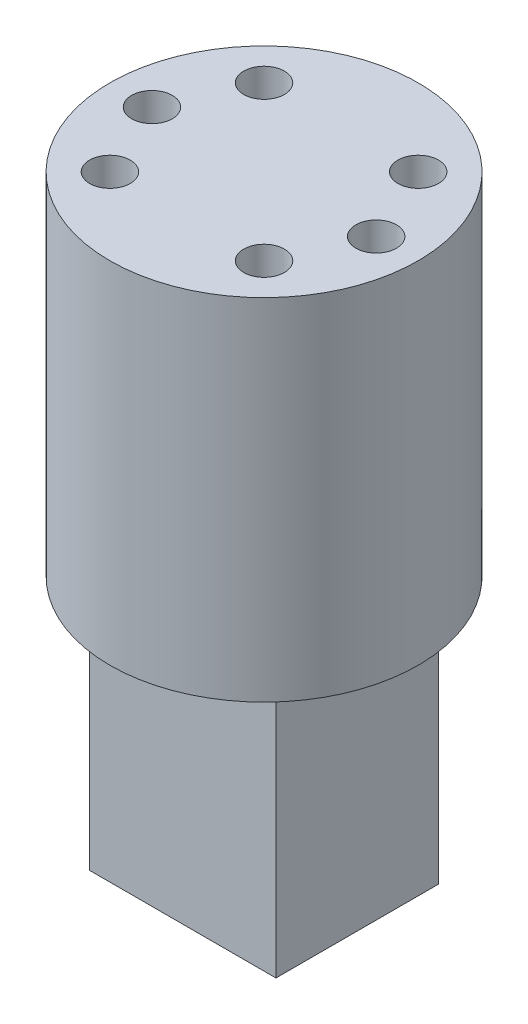
ISO-10303-21;
HEADER;
FILE_DESCRIPTION(('STEP AP214'),'2;1');
FILE_NAME('part.step','',(''),(''),'','','');
FILE_SCHEMA(('AUTOMOTIVE_DESIGN { 1 0 10303 214 1 1 1 1 }'));
ENDSEC;
DATA;
#1=APPLICATION_CONTEXT('core data for automotive mechanical design processes');
#2=APPLICATION_PROTOCOL_DEFINITION('international standard','automotive_design',2000,#1);
#3=PRODUCT_CONTEXT('',#1,'mechanical');
#4=PRODUCT('Part','Part','',(#3));
#5=PRODUCT_RELATED_PRODUCT_CATEGORY('part','',(#4));
#6=PRODUCT_DEFINITION_FORMATION('','',#4);
#7=PRODUCT_DEFINITION_CONTEXT('part definition',#1,'design');
#8=PRODUCT_DEFINITION('design','',#6,#7);
#9=PRODUCT_DEFINITION_SHAPE('','',#8);
#10=(LENGTH_UNIT() NAMED_UNIT(*) SI_UNIT(.MILLI.,.METRE.));
#11=(NAMED_UNIT(*) PLANE_ANGLE_UNIT() SI_UNIT($,.RADIAN.));
#12=(NAMED_UNIT(*) SI_UNIT($,.STERADIAN.) SOLID_ANGLE_UNIT());
#13=UNCERTAINTY_MEASURE_WITH_UNIT(LENGTH_MEASURE(1.E-05),#10,'distance_accuracy_value','');
#14=(GEOMETRIC_REPRESENTATION_CONTEXT(3) GLOBAL_UNCERTAINTY_ASSIGNED_CONTEXT((#13)) GLOBAL_UNIT_ASSIGNED_CONTEXT((#10,
#11,#12)) REPRESENTATION_CONTEXT('',''));
#15=CARTESIAN_POINT('',(0.,0.,0.));
#16=DIRECTION('',(0.,0.,1.));
#17=DIRECTION('',(1.,0.,0.));
#18=AXIS2_PLACEMENT_3D('',#15,#16,#17);
#19=CARTESIAN_POINT('',(0.,-25.,0.));
#20=DIRECTION('',(0.,1.,0.));
#21=DIRECTION('',(0.,0.,1.));
#22=AXIS2_PLACEMENT_3D('',#19,#20,#21);
#23=PLANE('',#22);
#24=CARTESIAN_POINT('',(0.,-25.,0.));
#25=DIRECTION('',(0.,1.,0.));
#26=DIRECTION('',(0.,0.,1.));
#27=AXIS2_PLACEMENT_3D('',#24,#25,#26);
#28=CIRCLE('',#27,11.);
#29=CARTESIAN_POINT('',(0.,-25.,11.));
#30=VERTEX_POINT('',#29);
#31=EDGE_CURVE('E48',#30,#30,#28,.T.);
#32=ORIENTED_EDGE('',*,*,#31,.F.);
#33=EDGE_LOOP('',(#32));
#34=FACE_BOUND('',#33,.T.);
#35=DIRECTION('',(0.,0.,1.));
#36=VECTOR('',#35,1.);
#37=CARTESIAN_POINT('',(6.65,-25.,5.8));
#38=LINE('',#37,#36);
#39=CARTESIAN_POINT('',(6.65,-25.,-5.8));
#40=VERTEX_POINT('',#39);
#41=CARTESIAN_POINT('',(6.65,-25.,5.8));
#42=VERTEX_POINT('',#41);
#43=EDGE_CURVE('E54',#40,#42,#38,.T.);
#44=ORIENTED_EDGE('',*,*,#43,.F.);
#45=DIRECTION('',(1.,0.,0.));
#46=VECTOR('',#45,1.);
#47=CARTESIAN_POINT('',(-6.65,-25.,-5.8));
#48=LINE('',#47,#46);
#49=CARTESIAN_POINT('',(-6.65,-25.,-5.8));
#50=VERTEX_POINT('',#49);
#51=EDGE_CURVE('E58',#50,#40,#48,.T.);
#52=ORIENTED_EDGE('',*,*,#51,.F.);
#53=DIRECTION('',(0.,0.,-1.));
#54=VECTOR('',#53,1.);
#55=CARTESIAN_POINT('',(-6.65,-25.,5.8));
#56=LINE('',#55,#54);
#57=CARTESIAN_POINT('',(-6.65,-25.,5.8));
#58=VERTEX_POINT('',#57);
#59=EDGE_CURVE('E157',#58,#50,#56,.T.);
#60=ORIENTED_EDGE('',*,*,#59,.F.);
#61=DIRECTION('',(-1.,0.,0.));
#62=VECTOR('',#61,1.);
#63=CARTESIAN_POINT('',(-6.65,-25.,5.8));
#64=LINE('',#63,#62);
#65=EDGE_CURVE('E156',#42,#58,#64,.T.);
#66=ORIENTED_EDGE('',*,*,#65,.F.);
#67=EDGE_LOOP('',(#44,#52,#60,#66));
#68=FACE_BOUND('',#67,.T.);
#69=ADVANCED_FACE('F37',(#34,#68),#23,.F.);
#70=CARTESIAN_POINT('',(0.,-25.,0.));
#71=DIRECTION('',(0.,1.,0.));
#72=DIRECTION('',(0.,0.,1.));
#73=AXIS2_PLACEMENT_3D('',#70,#71,#72);
#74=CYLINDRICAL_SURFACE('',#73,11.);
#75=ORIENTED_EDGE('',*,*,#31,.T.);
#76=EDGE_LOOP('',(#75));
#77=FACE_BOUND('',#76,.T.);
#78=CARTESIAN_POINT('',(0.,0.,0.));
#79=DIRECTION('',(0.,1.,0.));
#80=DIRECTION('',(0.,0.,1.));
#81=AXIS2_PLACEMENT_3D('',#78,#79,#80);
#82=CIRCLE('',#81,11.);
#83=CARTESIAN_POINT('',(0.,0.,11.));
#84=VERTEX_POINT('',#83);
#85=EDGE_CURVE('E152',#84,#84,#82,.T.);
#86=ORIENTED_EDGE('',*,*,#85,.F.);
#87=EDGE_LOOP('',(#86));
#88=FACE_BOUND('',#87,.T.);
#89=ADVANCED_FACE('F45',(#77,#88),#74,.T.);
#90=CARTESIAN_POINT('',(0.,0.,0.));
#91=DIRECTION('',(0.,1.,0.));
#92=DIRECTION('',(0.,0.,1.));
#93=AXIS2_PLACEMENT_3D('',#90,#91,#92);
#94=PLANE('',#93);
#95=CARTESIAN_POINT('',(-5.5,0.,-5.5));
#96=DIRECTION('',(0.,1.,0.));
#97=DIRECTION('',(0.,0.,1.));
#98=AXIS2_PLACEMENT_3D('',#95,#96,#97);
#99=CIRCLE('',#98,1.44999999999999);
#100=CARTESIAN_POINT('',(-5.5,0.,-4.05000000000001));
#101=VERTEX_POINT('',#100);
#102=EDGE_CURVE('E109',#101,#101,#99,.T.);
#103=ORIENTED_EDGE('',*,*,#102,.F.);
#104=EDGE_LOOP('',(#103));
#105=FACE_BOUND('',#104,.T.);
#106=CARTESIAN_POINT('',(5.5,0.,5.5));
#107=DIRECTION('',(0.,1.,0.));
#108=DIRECTION('',(0.,0.,1.));
#109=AXIS2_PLACEMENT_3D('',#106,#107,#108);
#110=CIRCLE('',#109,1.44999999999999);
#111=CARTESIAN_POINT('',(5.5,0.,6.94999999999999));
#112=VERTEX_POINT('',#111);
#113=EDGE_CURVE('E108',#112,#112,#110,.T.);
#114=ORIENTED_EDGE('',*,*,#113,.F.);
#115=EDGE_LOOP('',(#114));
#116=FACE_BOUND('',#115,.T.);
#117=CARTESIAN_POINT('',(-5.5,0.,5.5));
#118=DIRECTION('',(0.,1.,0.));
#119=DIRECTION('',(0.,0.,1.));
#120=AXIS2_PLACEMENT_3D('',#117,#118,#119);
#121=CIRCLE('',#120,1.44999999999999);
#122=CARTESIAN_POINT('',(-5.5,0.,6.94999999999999));
#123=VERTEX_POINT('',#122);
#124=EDGE_CURVE('E117',#123,#123,#121,.T.);
#125=ORIENTED_EDGE('',*,*,#124,.F.);
#126=EDGE_LOOP('',(#125));
#127=FACE_BOUND('',#126,.T.);
#128=CARTESIAN_POINT('',(5.5,0.,-5.5));
#129=DIRECTION('',(0.,1.,0.));
#130=DIRECTION('',(0.,0.,1.));
#131=AXIS2_PLACEMENT_3D('',#128,#129,#130);
#132=CIRCLE('',#131,1.44999999999999);
#133=CARTESIAN_POINT('',(5.5,0.,-4.05000000000001));
#134=VERTEX_POINT('',#133);
#135=EDGE_CURVE('E127',#134,#134,#132,.T.);
#136=ORIENTED_EDGE('',*,*,#135,.F.);
#137=EDGE_LOOP('',(#136));
#138=FACE_BOUND('',#137,.T.);
#139=CARTESIAN_POINT('',(8.,0.,0.));
#140=DIRECTION('',(0.,1.,0.));
#141=DIRECTION('',(0.,0.,1.));
#142=AXIS2_PLACEMENT_3D('',#139,#140,#141);
#143=CIRCLE('',#142,1.44999999999999);
#144=CARTESIAN_POINT('',(8.,0.,1.44999999999999));
#145=VERTEX_POINT('',#144);
#146=EDGE_CURVE('E135',#145,#145,#143,.T.);
#147=ORIENTED_EDGE('',*,*,#146,.F.);
#148=EDGE_LOOP('',(#147));
#149=FACE_BOUND('',#148,.T.);
#150=CARTESIAN_POINT('',(-8.,0.,0.));
#151=DIRECTION('',(0.,1.,0.));
#152=DIRECTION('',(0.,0.,1.));
#153=AXIS2_PLACEMENT_3D('',#150,#151,#152);
#154=CIRCLE('',#153,1.44999999999999);
#155=CARTESIAN_POINT('',(-8.,0.,1.44999999999999));
#156=VERTEX_POINT('',#155);
#157=EDGE_CURVE('E137',#156,#156,#154,.T.);
#158=ORIENTED_EDGE('',*,*,#157,.F.);
#159=EDGE_LOOP('',(#158));
#160=FACE_BOUND('',#159,.T.);
#161=ORIENTED_EDGE('',*,*,#85,.T.);
#162=EDGE_LOOP('',(#161));
#163=FACE_BOUND('',#162,.T.);
#164=ADVANCED_FACE('F180',(#105,#116,#127,#138,#149,#160,#163),#94,.T.);
#165=CARTESIAN_POINT('',(-6.65,-104.847946056128,-5.8));
#166=DIRECTION('',(0.,0.,1.));
#167=DIRECTION('',(1.,0.,0.));
#168=AXIS2_PLACEMENT_3D('',#165,#166,#167);
#169=PLANE('',#168);
#170=DIRECTION('',(0.,1.,0.));
#171=VECTOR('',#170,1.);
#172=CARTESIAN_POINT('',(6.65,-104.847946056128,-5.8));
#173=LINE('',#172,#171);
#174=CARTESIAN_POINT('',(6.65,-43.6,-5.8));
#175=VERTEX_POINT('',#174);
#176=EDGE_CURVE('E162',#175,#40,#173,.T.);
#177=ORIENTED_EDGE('',*,*,#176,.F.);
#178=DIRECTION('',(-1.,0.,0.));
#179=VECTOR('',#178,1.);
#180=CARTESIAN_POINT('',(-6.65,-43.6,-5.8));
#181=LINE('',#180,#179);
#182=CARTESIAN_POINT('',(-6.65,-43.6,-5.8));
#183=VERTEX_POINT('',#182);
#184=EDGE_CURVE('E146',#175,#183,#181,.T.);
#185=ORIENTED_EDGE('',*,*,#184,.T.);
#186=DIRECTION('',(0.,1.,0.));
#187=VECTOR('',#186,1.);
#188=CARTESIAN_POINT('',(-6.65,-104.847946056128,-5.8));
#189=LINE('',#188,#187);
#190=EDGE_CURVE('E164',#183,#50,#189,.T.);
#191=ORIENTED_EDGE('',*,*,#190,.T.);
#192=ORIENTED_EDGE('',*,*,#51,.T.);
#193=EDGE_LOOP('',(#177,#185,#191,#192));
#194=FACE_BOUND('',#193,.T.);
#195=ADVANCED_FACE('F190',(#194),#169,.F.);
#196=CARTESIAN_POINT('',(-6.65,-104.847946056128,5.8));
#197=DIRECTION('',(1.,0.,0.));
#198=DIRECTION('',(0.,0.,-1.));
#199=AXIS2_PLACEMENT_3D('',#196,#197,#198);
#200=PLANE('',#199);
#201=ORIENTED_EDGE('',*,*,#190,.F.);
#202=DIRECTION('',(0.,0.,1.));
#203=VECTOR('',#202,1.);
#204=CARTESIAN_POINT('',(-6.65,-43.6,5.8));
#205=LINE('',#204,#203);
#206=CARTESIAN_POINT('',(-6.65,-43.6,5.8));
#207=VERTEX_POINT('',#206);
#208=EDGE_CURVE('E145',#183,#207,#205,.T.);
#209=ORIENTED_EDGE('',*,*,#208,.T.);
#210=DIRECTION('',(0.,1.,0.));
#211=VECTOR('',#210,1.);
#212=CARTESIAN_POINT('',(-6.65,-104.847946056128,5.8));
#213=LINE('',#212,#211);
#214=EDGE_CURVE('E170',#207,#58,#213,.T.);
#215=ORIENTED_EDGE('',*,*,#214,.T.);
#216=ORIENTED_EDGE('',*,*,#59,.T.);
#217=EDGE_LOOP('',(#201,#209,#215,#216));
#218=FACE_BOUND('',#217,.T.);
#219=ADVANCED_FACE('F204',(#218),#200,.F.);
#220=CARTESIAN_POINT('',(-6.65,-104.847946056128,5.8));
#221=DIRECTION('',(0.,0.,-1.));
#222=DIRECTION('',(-1.,0.,0.));
#223=AXIS2_PLACEMENT_3D('',#220,#221,#222);
#224=PLANE('',#223);
#225=ORIENTED_EDGE('',*,*,#214,.F.);
#226=DIRECTION('',(1.,0.,0.));
#227=VECTOR('',#226,1.);
#228=CARTESIAN_POINT('',(-6.65,-43.6,5.8));
#229=LINE('',#228,#227);
#230=CARTESIAN_POINT('',(6.65,-43.6,5.8));
#231=VERTEX_POINT('',#230);
#232=EDGE_CURVE('E150',#207,#231,#229,.T.);
#233=ORIENTED_EDGE('',*,*,#232,.T.);
#234=DIRECTION('',(0.,1.,0.));
#235=VECTOR('',#234,1.);
#236=CARTESIAN_POINT('',(6.65,-104.847946056128,5.8));
#237=LINE('',#236,#235);
#238=EDGE_CURVE('E168',#231,#42,#237,.T.);
#239=ORIENTED_EDGE('',*,*,#238,.T.);
#240=ORIENTED_EDGE('',*,*,#65,.T.);
#241=EDGE_LOOP('',(#225,#233,#239,#240));
#242=FACE_BOUND('',#241,.T.);
#243=ADVANCED_FACE('F199',(#242),#224,.F.);
#244=CARTESIAN_POINT('',(6.65,-104.847946056128,5.8));
#245=DIRECTION('',(-1.,0.,0.));
#246=DIRECTION('',(0.,0.,1.));
#247=AXIS2_PLACEMENT_3D('',#244,#245,#246);
#248=PLANE('',#247);
#249=ORIENTED_EDGE('',*,*,#238,.F.);
#250=DIRECTION('',(0.,0.,-1.));
#251=VECTOR('',#250,1.);
#252=CARTESIAN_POINT('',(6.65,-43.6,5.8));
#253=LINE('',#252,#251);
#254=EDGE_CURVE('E151',#231,#175,#253,.T.);
#255=ORIENTED_EDGE('',*,*,#254,.T.);
#256=ORIENTED_EDGE('',*,*,#176,.T.);
#257=ORIENTED_EDGE('',*,*,#43,.T.);
#258=EDGE_LOOP('',(#249,#255,#256,#257));
#259=FACE_BOUND('',#258,.T.);
#260=ADVANCED_FACE('F198',(#259),#248,.F.);
#261=CARTESIAN_POINT('',(0.,-43.6,0.));
#262=DIRECTION('',(0.,1.,0.));
#263=DIRECTION('',(0.,0.,1.));
#264=AXIS2_PLACEMENT_3D('',#261,#262,#263);
#265=PLANE('',#264);
#266=CARTESIAN_POINT('',(0.,-43.6,0.));
#267=DIRECTION('',(0.,1.,0.));
#268=DIRECTION('',(0.,0.,1.));
#269=AXIS2_PLACEMENT_3D('',#266,#267,#268);
#270=CIRCLE('',#269,2.5);
#271=CARTESIAN_POINT('',(0.,-43.6,2.5));
#272=VERTEX_POINT('',#271);
#273=EDGE_CURVE('E12',#272,#272,#270,.F.);
#274=ORIENTED_EDGE('',*,*,#273,.F.);
#275=EDGE_LOOP('',(#274));
#276=FACE_BOUND('',#275,.T.);
#277=ORIENTED_EDGE('',*,*,#232,.F.);
#278=ORIENTED_EDGE('',*,*,#208,.F.);
#279=ORIENTED_EDGE('',*,*,#184,.F.);
#280=ORIENTED_EDGE('',*,*,#254,.F.);
#281=EDGE_LOOP('',(#277,#278,#279,#280));
#282=FACE_BOUND('',#281,.T.);
#283=ADVANCED_FACE('F200',(#276,#282),#265,.F.);
#284=CARTESIAN_POINT('',(0.,-43.6,0.));
#285=DIRECTION('',(0.,1.,0.));
#286=DIRECTION('',(-1.,0.,0.));
#287=AXIS2_PLACEMENT_3D('',#284,#285,#286);
#288=CONICAL_SURFACE('',#287,2.5,0.896055384571343);
#289=CARTESIAN_POINT('',(0.,-45.6,0.));
#290=VERTEX_POINT('',#289);
#291=VERTEX_LOOP('',#290);
#292=FACE_BOUND('',#291,.T.);
#293=ORIENTED_EDGE('',*,*,#273,.T.);
#294=EDGE_LOOP('',(#293));
#295=FACE_BOUND('',#294,.T.);
#296=ADVANCED_FACE('F213',(#292,#295),#288,.T.);
#297=CARTESIAN_POINT('',(-8.,-5.,0.));
#298=DIRECTION('',(0.,1.,0.));
#299=DIRECTION('',(0.,0.,1.));
#300=AXIS2_PLACEMENT_3D('',#297,#298,#299);
#301=CONICAL_SURFACE('',#300,1.44999999999999,1.02974425867665);
#302=CARTESIAN_POINT('',(-8.,-5.87124789758996,0.));
#303=VERTEX_POINT('',#302);
#304=VERTEX_LOOP('',#303);
#305=FACE_BOUND('',#304,.T.);
#306=CARTESIAN_POINT('',(-8.,-5.,0.));
#307=DIRECTION('',(0.,1.,0.));
#308=DIRECTION('',(0.,0.,1.));
#309=AXIS2_PLACEMENT_3D('',#306,#307,#308);
#310=CIRCLE('',#309,1.44999999999999);
#311=CARTESIAN_POINT('',(-8.,-5.,1.44999999999999));
#312=VERTEX_POINT('',#311);
#313=EDGE_CURVE('E143',#312,#312,#310,.T.);
#314=ORIENTED_EDGE('',*,*,#313,.T.);
#315=EDGE_LOOP('',(#314));
#316=FACE_BOUND('',#315,.T.);
#317=ADVANCED_FACE('F220',(#305,#316),#301,.F.);
#318=CARTESIAN_POINT('',(-8.,0.,0.));
#319=DIRECTION('',(0.,1.,0.));
#320=DIRECTION('',(0.,0.,1.));
#321=AXIS2_PLACEMENT_3D('',#318,#319,#320);
#322=CYLINDRICAL_SURFACE('',#321,1.44999999999999);
#323=ORIENTED_EDGE('',*,*,#313,.F.);
#324=EDGE_LOOP('',(#323));
#325=FACE_BOUND('',#324,.T.);
#326=ORIENTED_EDGE('',*,*,#157,.T.);
#327=EDGE_LOOP('',(#326));
#328=FACE_BOUND('',#327,.T.);
#329=ADVANCED_FACE('F222',(#325,#328),#322,.F.);
#330=CARTESIAN_POINT('',(8.,-5.,0.));
#331=DIRECTION('',(0.,1.,0.));
#332=DIRECTION('',(0.,0.,1.));
#333=AXIS2_PLACEMENT_3D('',#330,#331,#332);
#334=CONICAL_SURFACE('',#333,1.44999999999999,1.02974425867665);
#335=CARTESIAN_POINT('',(8.,-5.87124789758996,0.));
#336=VERTEX_POINT('',#335);
#337=VERTEX_LOOP('',#336);
#338=FACE_BOUND('',#337,.T.);
#339=CARTESIAN_POINT('',(8.,-5.,0.));
#340=DIRECTION('',(0.,1.,0.));
#341=DIRECTION('',(0.,0.,1.));
#342=AXIS2_PLACEMENT_3D('',#339,#340,#341);
#343=CIRCLE('',#342,1.44999999999999);
#344=CARTESIAN_POINT('',(8.,-5.,1.44999999999999));
#345=VERTEX_POINT('',#344);
#346=EDGE_CURVE('E132',#345,#345,#343,.T.);
#347=ORIENTED_EDGE('',*,*,#346,.T.);
#348=EDGE_LOOP('',(#347));
#349=FACE_BOUND('',#348,.T.);
#350=ADVANCED_FACE('F223',(#338,#349),#334,.F.);
#351=CARTESIAN_POINT('',(8.,0.,0.));
#352=DIRECTION('',(0.,1.,0.));
#353=DIRECTION('',(0.,0.,1.));
#354=AXIS2_PLACEMENT_3D('',#351,#352,#353);
#355=CYLINDRICAL_SURFACE('',#354,1.44999999999999);
#356=ORIENTED_EDGE('',*,*,#346,.F.);
#357=EDGE_LOOP('',(#356));
#358=FACE_BOUND('',#357,.T.);
#359=ORIENTED_EDGE('',*,*,#146,.T.);
#360=EDGE_LOOP('',(#359));
#361=FACE_BOUND('',#360,.T.);
#362=ADVANCED_FACE('F229',(#358,#361),#355,.F.);
#363=CARTESIAN_POINT('',(5.5,-5.,-5.5));
#364=DIRECTION('',(0.,1.,0.));
#365=DIRECTION('',(0.,0.,1.));
#366=AXIS2_PLACEMENT_3D('',#363,#364,#365);
#367=CONICAL_SURFACE('',#366,1.44999999999999,1.02974425867665);
#368=CARTESIAN_POINT('',(5.5,-5.87124789758996,-5.5));
#369=VERTEX_POINT('',#368);
#370=VERTEX_LOOP('',#369);
#371=FACE_BOUND('',#370,.T.);
#372=CARTESIAN_POINT('',(5.5,-5.,-5.5));
#373=DIRECTION('',(0.,1.,0.));
#374=DIRECTION('',(0.,0.,1.));
#375=AXIS2_PLACEMENT_3D('',#372,#373,#374);
#376=CIRCLE('',#375,1.44999999999999);
#377=CARTESIAN_POINT('',(5.5,-5.,-4.05000000000001));
#378=VERTEX_POINT('',#377);
#379=EDGE_CURVE('E129',#378,#378,#376,.T.);
#380=ORIENTED_EDGE('',*,*,#379,.T.);
#381=EDGE_LOOP('',(#380));
#382=FACE_BOUND('',#381,.T.);
#383=ADVANCED_FACE('F232',(#371,#382),#367,.F.);
#384=CARTESIAN_POINT('',(5.5,0.,-5.5));
#385=DIRECTION('',(0.,1.,0.));
#386=DIRECTION('',(0.,0.,1.));
#387=AXIS2_PLACEMENT_3D('',#384,#385,#386);
#388=CYLINDRICAL_SURFACE('',#387,1.44999999999999);
#389=ORIENTED_EDGE('',*,*,#379,.F.);
#390=EDGE_LOOP('',(#389));
#391=FACE_BOUND('',#390,.T.);
#392=ORIENTED_EDGE('',*,*,#135,.T.);
#393=EDGE_LOOP('',(#392));
#394=FACE_BOUND('',#393,.T.);
#395=ADVANCED_FACE('F240',(#391,#394),#388,.F.);
#396=CARTESIAN_POINT('',(-5.5,-5.,5.5));
#397=DIRECTION('',(0.,1.,0.));
#398=DIRECTION('',(0.,0.,1.));
#399=AXIS2_PLACEMENT_3D('',#396,#397,#398);
#400=CONICAL_SURFACE('',#399,1.44999999999999,1.02974425867665);
#401=CARTESIAN_POINT('',(-5.5,-5.87124789758996,5.5));
#402=VERTEX_POINT('',#401);
#403=VERTEX_LOOP('',#402);
#404=FACE_BOUND('',#403,.T.);
#405=CARTESIAN_POINT('',(-5.5,-5.,5.5));
#406=DIRECTION('',(0.,1.,0.));
#407=DIRECTION('',(0.,0.,1.));
#408=AXIS2_PLACEMENT_3D('',#405,#406,#407);
#409=CIRCLE('',#408,1.44999999999999);
#410=CARTESIAN_POINT('',(-5.5,-5.,6.94999999999999));
#411=VERTEX_POINT('',#410);
#412=EDGE_CURVE('E122',#411,#411,#409,.T.);
#413=ORIENTED_EDGE('',*,*,#412,.T.);
#414=EDGE_LOOP('',(#413));
#415=FACE_BOUND('',#414,.T.);
#416=ADVANCED_FACE('F243',(#404,#415),#400,.F.);
#417=CARTESIAN_POINT('',(-5.5,0.,5.5));
#418=DIRECTION('',(0.,1.,0.));
#419=DIRECTION('',(0.,0.,1.));
#420=AXIS2_PLACEMENT_3D('',#417,#418,#419);
#421=CYLINDRICAL_SURFACE('',#420,1.44999999999999);
#422=ORIENTED_EDGE('',*,*,#412,.F.);
#423=EDGE_LOOP('',(#422));
#424=FACE_BOUND('',#423,.T.);
#425=ORIENTED_EDGE('',*,*,#124,.T.);
#426=EDGE_LOOP('',(#425));
#427=FACE_BOUND('',#426,.T.);
#428=ADVANCED_FACE('F242',(#424,#427),#421,.F.);
#429=CARTESIAN_POINT('',(5.5,-5.,5.5));
#430=DIRECTION('',(0.,1.,0.));
#431=DIRECTION('',(0.,0.,1.));
#432=AXIS2_PLACEMENT_3D('',#429,#430,#431);
#433=CONICAL_SURFACE('',#432,1.44999999999999,1.02974425867665);
#434=CARTESIAN_POINT('',(5.5,-5.87124789758996,5.5));
#435=VERTEX_POINT('',#434);
#436=VERTEX_LOOP('',#435);
#437=FACE_BOUND('',#436,.T.);
#438=CARTESIAN_POINT('',(5.5,-5.,5.5));
#439=DIRECTION('',(0.,1.,0.));
#440=DIRECTION('',(0.,0.,1.));
#441=AXIS2_PLACEMENT_3D('',#438,#439,#440);
#442=CIRCLE('',#441,1.44999999999999);
#443=CARTESIAN_POINT('',(5.5,-5.,6.94999999999999));
#444=VERTEX_POINT('',#443);
#445=EDGE_CURVE('E114',#444,#444,#442,.T.);
#446=ORIENTED_EDGE('',*,*,#445,.T.);
#447=EDGE_LOOP('',(#446));
#448=FACE_BOUND('',#447,.T.);
#449=ADVANCED_FACE('F250',(#437,#448),#433,.F.);
#450=CARTESIAN_POINT('',(5.5,0.,5.5));
#451=DIRECTION('',(0.,1.,0.));
#452=DIRECTION('',(0.,0.,1.));
#453=AXIS2_PLACEMENT_3D('',#450,#451,#452);
#454=CYLINDRICAL_SURFACE('',#453,1.44999999999999);
#455=ORIENTED_EDGE('',*,*,#445,.F.);
#456=EDGE_LOOP('',(#455));
#457=FACE_BOUND('',#456,.T.);
#458=ORIENTED_EDGE('',*,*,#113,.T.);
#459=EDGE_LOOP('',(#458));
#460=FACE_BOUND('',#459,.T.);
#461=ADVANCED_FACE('F103',(#457,#460),#454,.F.);
#462=CARTESIAN_POINT('',(-5.5,-5.,-5.5));
#463=DIRECTION('',(0.,1.,0.));
#464=DIRECTION('',(0.,0.,1.));
#465=AXIS2_PLACEMENT_3D('',#462,#463,#464);
#466=CONICAL_SURFACE('',#465,1.44999999999999,1.02974425867665);
#467=CARTESIAN_POINT('',(-5.5,-5.87124789758996,-5.5));
#468=VERTEX_POINT('',#467);
#469=VERTEX_LOOP('',#468);
#470=FACE_BOUND('',#469,.T.);
#471=CARTESIAN_POINT('',(-5.5,-5.,-5.5));
#472=DIRECTION('',(0.,1.,0.));
#473=DIRECTION('',(0.,0.,1.));
#474=AXIS2_PLACEMENT_3D('',#471,#472,#473);
#475=CIRCLE('',#474,1.44999999999999);
#476=CARTESIAN_POINT('',(-5.5,-5.,-4.05000000000001));
#477=VERTEX_POINT('',#476);
#478=EDGE_CURVE('E110',#477,#477,#475,.T.);
#479=ORIENTED_EDGE('',*,*,#478,.T.);
#480=EDGE_LOOP('',(#479));
#481=FACE_BOUND('',#480,.T.);
#482=ADVANCED_FACE('F97',(#470,#481),#466,.F.);
#483=CARTESIAN_POINT('',(-5.5,0.,-5.5));
#484=DIRECTION('',(0.,1.,0.));
#485=DIRECTION('',(0.,0.,1.));
#486=AXIS2_PLACEMENT_3D('',#483,#484,#485);
#487=CYLINDRICAL_SURFACE('',#486,1.44999999999999);
#488=ORIENTED_EDGE('',*,*,#478,.F.);
#489=EDGE_LOOP('',(#488));
#490=FACE_BOUND('',#489,.T.);
#491=ORIENTED_EDGE('',*,*,#102,.T.);
#492=EDGE_LOOP('',(#491));
#493=FACE_BOUND('',#492,.T.);
#494=ADVANCED_FACE('F105',(#490,#493),#487,.F.);
#495=CLOSED_SHELL('',(#69,#89,#164,#195,#219,#243,#260,#283,#296,#317,#329,#350,#362,#383,#395,
#416,#428,#449,#461,#482,#494));
#496=MANIFOLD_SOLID_BREP('B2',#495);
#497=ADVANCED_BREP_SHAPE_REPRESENTATION('',(#18,#496),#14);
#498=SHAPE_DEFINITION_REPRESENTATION(#9,#497);
ENDSEC;
END-ISO-10303-21;
